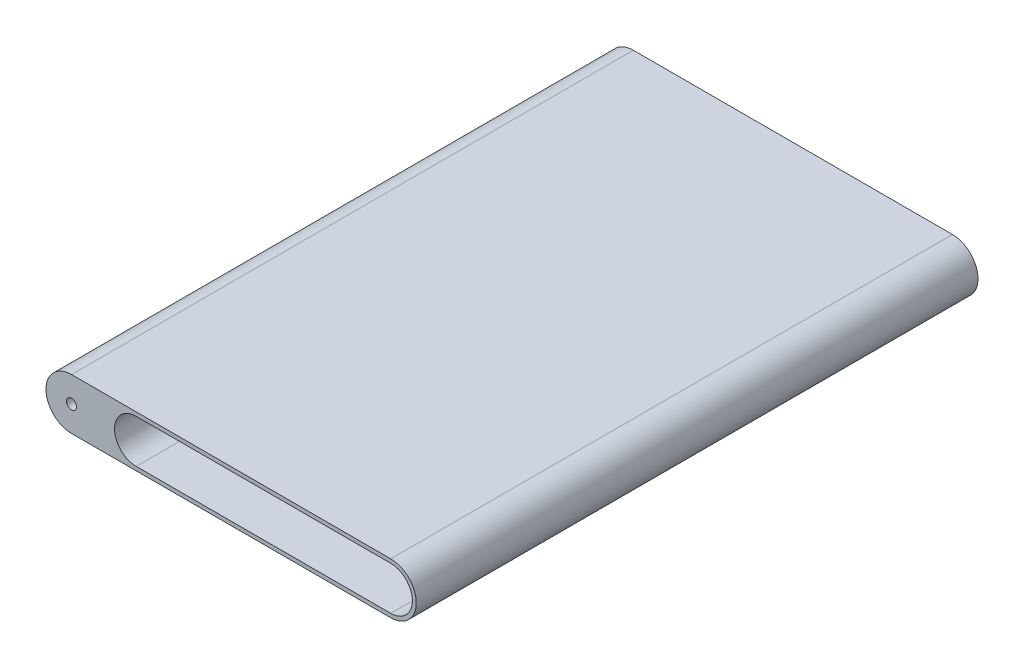
ISO-10303-21;
HEADER;
FILE_DESCRIPTION(('STEP AP214'),'2;1');
FILE_NAME('part.step','',(''),(''),'','','');
FILE_SCHEMA(('AUTOMOTIVE_DESIGN { 1 0 10303 214 1 1 1 1 }'));
ENDSEC;
DATA;
#1=APPLICATION_CONTEXT('core data for automotive mechanical design processes');
#2=APPLICATION_PROTOCOL_DEFINITION('international standard','automotive_design',2000,#1);
#3=PRODUCT_CONTEXT('',#1,'mechanical');
#4=PRODUCT('Part','Part','',(#3));
#5=PRODUCT_RELATED_PRODUCT_CATEGORY('part','',(#4));
#6=PRODUCT_DEFINITION_FORMATION('','',#4);
#7=PRODUCT_DEFINITION_CONTEXT('part definition',#1,'design');
#8=PRODUCT_DEFINITION('design','',#6,#7);
#9=PRODUCT_DEFINITION_SHAPE('','',#8);
#10=(LENGTH_UNIT() NAMED_UNIT(*) SI_UNIT(.MILLI.,.METRE.));
#11=(NAMED_UNIT(*) PLANE_ANGLE_UNIT() SI_UNIT($,.RADIAN.));
#12=(NAMED_UNIT(*) SI_UNIT($,.STERADIAN.) SOLID_ANGLE_UNIT());
#13=UNCERTAINTY_MEASURE_WITH_UNIT(LENGTH_MEASURE(1.E-05),#10,'distance_accuracy_value','');
#14=(GEOMETRIC_REPRESENTATION_CONTEXT(3) GLOBAL_UNCERTAINTY_ASSIGNED_CONTEXT((#13)) GLOBAL_UNIT_ASSIGNED_CONTEXT((#10,
#11,#12)) REPRESENTATION_CONTEXT('',''));
#15=CARTESIAN_POINT('',(0.,0.,0.));
#16=DIRECTION('',(0.,0.,1.));
#17=DIRECTION('',(1.,0.,0.));
#18=AXIS2_PLACEMENT_3D('',#15,#16,#17);
#19=CARTESIAN_POINT('',(0.,0.,1117.6));
#20=DIRECTION('',(0.,0.,-1.));
#21=DIRECTION('',(-1.,0.,0.));
#22=AXIS2_PLACEMENT_3D('',#19,#20,#21);
#23=CYLINDRICAL_SURFACE('',#22,50.8);
#24=CARTESIAN_POINT('',(0.,0.,0.));
#25=DIRECTION('',(0.,0.,1.));
#26=DIRECTION('',(1.,0.,0.));
#27=AXIS2_PLACEMENT_3D('',#24,#25,#26);
#28=CIRCLE('',#27,50.8);
#29=CARTESIAN_POINT('',(0.,-50.8,0.));
#30=VERTEX_POINT('',#29);
#31=CARTESIAN_POINT('',(0.,50.8,0.));
#32=VERTEX_POINT('',#31);
#33=EDGE_CURVE('E137',#30,#32,#28,.T.);
#34=ORIENTED_EDGE('',*,*,#33,.T.);
#35=DIRECTION('',(0.,0.,-1.));
#36=VECTOR('',#35,1.);
#37=CARTESIAN_POINT('',(0.,50.8,1117.6));
#38=LINE('',#37,#36);
#39=CARTESIAN_POINT('',(0.,50.8,1117.6));
#40=VERTEX_POINT('',#39);
#41=EDGE_CURVE('E11',#40,#32,#38,.T.);
#42=ORIENTED_EDGE('',*,*,#41,.F.);
#43=CARTESIAN_POINT('',(0.,0.,1117.6));
#44=DIRECTION('',(0.,0.,1.));
#45=DIRECTION('',(1.,0.,0.));
#46=AXIS2_PLACEMENT_3D('',#43,#44,#45);
#47=CIRCLE('',#46,50.8);
#48=CARTESIAN_POINT('',(0.,-50.8,1117.6));
#49=VERTEX_POINT('',#48);
#50=EDGE_CURVE('E146',#49,#40,#47,.T.);
#51=ORIENTED_EDGE('',*,*,#50,.F.);
#52=DIRECTION('',(0.,0.,-1.));
#53=VECTOR('',#52,1.);
#54=CARTESIAN_POINT('',(0.,-50.8,1117.6));
#55=LINE('',#54,#53);
#56=EDGE_CURVE('E156',#49,#30,#55,.T.);
#57=ORIENTED_EDGE('',*,*,#56,.T.);
#58=EDGE_LOOP('',(#34,#42,#51,#57));
#59=FACE_BOUND('',#58,.T.);
#60=ADVANCED_FACE('F39',(#59),#23,.T.);
#61=CARTESIAN_POINT('',(0.,50.8,1117.6));
#62=DIRECTION('',(0.,-1.,0.));
#63=DIRECTION('',(1.,0.,0.));
#64=AXIS2_PLACEMENT_3D('',#61,#62,#63);
#65=PLANE('',#64);
#66=DIRECTION('',(-1.,0.,0.));
#67=VECTOR('',#66,1.);
#68=CARTESIAN_POINT('',(0.,50.8,0.));
#69=LINE('',#68,#67);
#70=CARTESIAN_POINT('',(-635.,50.7999999999999,0.));
#71=VERTEX_POINT('',#70);
#72=EDGE_CURVE('E159',#32,#71,#69,.T.);
#73=ORIENTED_EDGE('',*,*,#72,.T.);
#74=DIRECTION('',(0.,0.,-1.));
#75=VECTOR('',#74,1.);
#76=CARTESIAN_POINT('',(-635.,50.7999999999999,1117.6));
#77=LINE('',#76,#75);
#78=CARTESIAN_POINT('',(-635.,50.7999999999999,1117.6));
#79=VERTEX_POINT('',#78);
#80=EDGE_CURVE('E46',#79,#71,#77,.T.);
#81=ORIENTED_EDGE('',*,*,#80,.F.);
#82=DIRECTION('',(-1.,0.,0.));
#83=VECTOR('',#82,1.);
#84=CARTESIAN_POINT('',(0.,50.8,1117.6));
#85=LINE('',#84,#83);
#86=EDGE_CURVE('E149',#40,#79,#85,.T.);
#87=ORIENTED_EDGE('',*,*,#86,.F.);
#88=ORIENTED_EDGE('',*,*,#41,.T.);
#89=EDGE_LOOP('',(#73,#81,#87,#88));
#90=FACE_BOUND('',#89,.T.);
#91=ADVANCED_FACE('F188',(#90),#65,.F.);
#92=CARTESIAN_POINT('',(-635.,0.,1117.6));
#93=DIRECTION('',(0.,0.,-1.));
#94=DIRECTION('',(-1.,0.,0.));
#95=AXIS2_PLACEMENT_3D('',#92,#93,#94);
#96=CYLINDRICAL_SURFACE('',#95,50.8);
#97=CARTESIAN_POINT('',(-635.,0.,0.));
#98=DIRECTION('',(0.,0.,1.));
#99=DIRECTION('',(1.,0.,0.));
#100=AXIS2_PLACEMENT_3D('',#97,#98,#99);
#101=CIRCLE('',#100,50.8);
#102=CARTESIAN_POINT('',(-635.,-50.8000000000001,0.));
#103=VERTEX_POINT('',#102);
#104=EDGE_CURVE('E161',#71,#103,#101,.T.);
#105=ORIENTED_EDGE('',*,*,#104,.T.);
#106=DIRECTION('',(0.,0.,-1.));
#107=VECTOR('',#106,1.);
#108=CARTESIAN_POINT('',(-635.,-50.8000000000001,1117.6));
#109=LINE('',#108,#107);
#110=CARTESIAN_POINT('',(-635.,-50.8000000000001,1117.6));
#111=VERTEX_POINT('',#110);
#112=EDGE_CURVE('E166',#111,#103,#109,.T.);
#113=ORIENTED_EDGE('',*,*,#112,.F.);
#114=CARTESIAN_POINT('',(-635.,0.,1117.6));
#115=DIRECTION('',(0.,0.,1.));
#116=DIRECTION('',(1.,0.,0.));
#117=AXIS2_PLACEMENT_3D('',#114,#115,#116);
#118=CIRCLE('',#117,50.8);
#119=EDGE_CURVE('E152',#79,#111,#118,.T.);
#120=ORIENTED_EDGE('',*,*,#119,.F.);
#121=ORIENTED_EDGE('',*,*,#80,.T.);
#122=EDGE_LOOP('',(#105,#113,#120,#121));
#123=FACE_BOUND('',#122,.T.);
#124=ADVANCED_FACE('F173',(#123),#96,.T.);
#125=CARTESIAN_POINT('',(0.,-50.8,1117.6));
#126=DIRECTION('',(0.,1.,0.));
#127=DIRECTION('',(-1.,0.,0.));
#128=AXIS2_PLACEMENT_3D('',#125,#126,#127);
#129=PLANE('',#128);
#130=DIRECTION('',(1.,0.,0.));
#131=VECTOR('',#130,1.);
#132=CARTESIAN_POINT('',(0.,-50.8,0.));
#133=LINE('',#132,#131);
#134=EDGE_CURVE('E150',#103,#30,#133,.T.);
#135=ORIENTED_EDGE('',*,*,#134,.T.);
#136=ORIENTED_EDGE('',*,*,#56,.F.);
#137=DIRECTION('',(1.,0.,0.));
#138=VECTOR('',#137,1.);
#139=CARTESIAN_POINT('',(0.,-50.8,1117.6));
#140=LINE('',#139,#138);
#141=EDGE_CURVE('E154',#111,#49,#140,.T.);
#142=ORIENTED_EDGE('',*,*,#141,.F.);
#143=ORIENTED_EDGE('',*,*,#112,.T.);
#144=EDGE_LOOP('',(#135,#136,#142,#143));
#145=FACE_BOUND('',#144,.T.);
#146=ADVANCED_FACE('F181',(#145),#129,.F.);
#147=CARTESIAN_POINT('',(0.,0.,1117.6));
#148=DIRECTION('',(0.,0.,1.));
#149=DIRECTION('',(1.,0.,0.));
#150=AXIS2_PLACEMENT_3D('',#147,#148,#149);
#151=PLANE('',#150);
#152=CARTESIAN_POINT('',(0.,0.,1117.6));
#153=DIRECTION('',(0.,0.,1.));
#154=DIRECTION('',(1.,0.,0.));
#155=AXIS2_PLACEMENT_3D('',#152,#153,#154);
#156=CIRCLE('',#155,43.1046435129124);
#157=CARTESIAN_POINT('',(0.,-43.1046435129124,1117.6));
#158=VERTEX_POINT('',#157);
#159=CARTESIAN_POINT('',(0.,43.1046435129124,1117.6));
#160=VERTEX_POINT('',#159);
#161=EDGE_CURVE('E53',#158,#160,#156,.T.);
#162=ORIENTED_EDGE('',*,*,#161,.F.);
#163=DIRECTION('',(1.,0.,0.));
#164=VECTOR('',#163,1.);
#165=CARTESIAN_POINT('',(0.,-43.1046435129124,1117.6));
#166=LINE('',#165,#164);
#167=CARTESIAN_POINT('',(-506.395864424996,-43.1046435129124,1117.6));
#168=VERTEX_POINT('',#167);
#169=EDGE_CURVE('E121',#168,#158,#166,.T.);
#170=ORIENTED_EDGE('',*,*,#169,.F.);
#171=CARTESIAN_POINT('',(-506.395864424996,0.,1117.6));
#172=DIRECTION('',(0.,0.,1.));
#173=DIRECTION('',(1.,0.,0.));
#174=AXIS2_PLACEMENT_3D('',#171,#172,#173);
#175=CIRCLE('',#174,43.1046435129124);
#176=CARTESIAN_POINT('',(-506.395864424996,43.1046435129124,1117.6));
#177=VERTEX_POINT('',#176);
#178=EDGE_CURVE('E124',#177,#168,#175,.T.);
#179=ORIENTED_EDGE('',*,*,#178,.F.);
#180=DIRECTION('',(-1.,0.,0.));
#181=VECTOR('',#180,1.);
#182=CARTESIAN_POINT('',(0.,43.1046435129124,1117.6));
#183=LINE('',#182,#181);
#184=EDGE_CURVE('E130',#160,#177,#183,.T.);
#185=ORIENTED_EDGE('',*,*,#184,.F.);
#186=EDGE_LOOP('',(#162,#170,#179,#185));
#187=FACE_BOUND('',#186,.T.);
#188=CARTESIAN_POINT('',(-635.,0.,1117.6));
#189=DIRECTION('',(0.,0.,1.));
#190=DIRECTION('',(1.,0.,0.));
#191=AXIS2_PLACEMENT_3D('',#188,#189,#190);
#192=CIRCLE('',#191,9.99999999999998);
#193=CARTESIAN_POINT('',(-625.,0.,1117.6));
#194=VERTEX_POINT('',#193);
#195=EDGE_CURVE('E143',#194,#194,#192,.T.);
#196=ORIENTED_EDGE('',*,*,#195,.F.);
#197=EDGE_LOOP('',(#196));
#198=FACE_BOUND('',#197,.T.);
#199=ORIENTED_EDGE('',*,*,#50,.T.);
#200=ORIENTED_EDGE('',*,*,#86,.T.);
#201=ORIENTED_EDGE('',*,*,#119,.T.);
#202=ORIENTED_EDGE('',*,*,#141,.T.);
#203=EDGE_LOOP('',(#199,#200,#201,#202));
#204=FACE_BOUND('',#203,.T.);
#205=ADVANCED_FACE('F187',(#187,#198,#204),#151,.T.);
#206=CARTESIAN_POINT('',(0.,0.,0.));
#207=DIRECTION('',(0.,0.,1.));
#208=DIRECTION('',(1.,0.,0.));
#209=AXIS2_PLACEMENT_3D('',#206,#207,#208);
#210=PLANE('',#209);
#211=DIRECTION('',(1.,0.,0.));
#212=VECTOR('',#211,1.);
#213=CARTESIAN_POINT('',(0.,-43.1046435129124,0.));
#214=LINE('',#213,#212);
#215=CARTESIAN_POINT('',(-506.395864424996,-43.1046435129124,0.));
#216=VERTEX_POINT('',#215);
#217=CARTESIAN_POINT('',(0.,-43.1046435129124,0.));
#218=VERTEX_POINT('',#217);
#219=EDGE_CURVE('E111',#216,#218,#214,.T.);
#220=ORIENTED_EDGE('',*,*,#219,.T.);
#221=CARTESIAN_POINT('',(0.,0.,0.));
#222=DIRECTION('',(0.,0.,1.));
#223=DIRECTION('',(1.,0.,0.));
#224=AXIS2_PLACEMENT_3D('',#221,#222,#223);
#225=CIRCLE('',#224,43.1046435129124);
#226=CARTESIAN_POINT('',(0.,43.1046435129124,0.));
#227=VERTEX_POINT('',#226);
#228=EDGE_CURVE('E105',#218,#227,#225,.T.);
#229=ORIENTED_EDGE('',*,*,#228,.T.);
#230=DIRECTION('',(-1.,0.,0.));
#231=VECTOR('',#230,1.);
#232=CARTESIAN_POINT('',(0.,43.1046435129124,0.));
#233=LINE('',#232,#231);
#234=CARTESIAN_POINT('',(-506.395864424996,43.1046435129124,0.));
#235=VERTEX_POINT('',#234);
#236=EDGE_CURVE('E114',#227,#235,#233,.T.);
#237=ORIENTED_EDGE('',*,*,#236,.T.);
#238=CARTESIAN_POINT('',(-506.395864424996,0.,0.));
#239=DIRECTION('',(0.,0.,1.));
#240=DIRECTION('',(1.,0.,0.));
#241=AXIS2_PLACEMENT_3D('',#238,#239,#240);
#242=CIRCLE('',#241,43.1046435129124);
#243=EDGE_CURVE('E61',#235,#216,#242,.T.);
#244=ORIENTED_EDGE('',*,*,#243,.T.);
#245=EDGE_LOOP('',(#220,#229,#237,#244));
#246=FACE_BOUND('',#245,.T.);
#247=CARTESIAN_POINT('',(-635.,0.,0.));
#248=DIRECTION('',(0.,0.,1.));
#249=DIRECTION('',(1.,0.,0.));
#250=AXIS2_PLACEMENT_3D('',#247,#248,#249);
#251=CIRCLE('',#250,9.99999999999998);
#252=CARTESIAN_POINT('',(-625.,0.,0.));
#253=VERTEX_POINT('',#252);
#254=EDGE_CURVE('E131',#253,#253,#251,.T.);
#255=ORIENTED_EDGE('',*,*,#254,.T.);
#256=EDGE_LOOP('',(#255));
#257=FACE_BOUND('',#256,.T.);
#258=ORIENTED_EDGE('',*,*,#33,.F.);
#259=ORIENTED_EDGE('',*,*,#134,.F.);
#260=ORIENTED_EDGE('',*,*,#104,.F.);
#261=ORIENTED_EDGE('',*,*,#72,.F.);
#262=EDGE_LOOP('',(#258,#259,#260,#261));
#263=FACE_BOUND('',#262,.T.);
#264=ADVANCED_FACE('F118',(#246,#257,#263),#210,.F.);
#265=CARTESIAN_POINT('',(-635.,0.,0.));
#266=DIRECTION('',(0.,0.,1.));
#267=DIRECTION('',(1.,0.,0.));
#268=AXIS2_PLACEMENT_3D('',#265,#266,#267);
#269=CYLINDRICAL_SURFACE('',#268,9.99999999999998);
#270=ORIENTED_EDGE('',*,*,#254,.F.);
#271=EDGE_LOOP('',(#270));
#272=FACE_BOUND('',#271,.T.);
#273=ORIENTED_EDGE('',*,*,#195,.T.);
#274=EDGE_LOOP('',(#273));
#275=FACE_BOUND('',#274,.T.);
#276=ADVANCED_FACE('F200',(#272,#275),#269,.F.);
#277=CARTESIAN_POINT('',(0.,0.,0.));
#278=DIRECTION('',(0.,0.,1.));
#279=DIRECTION('',(1.,0.,0.));
#280=AXIS2_PLACEMENT_3D('',#277,#278,#279);
#281=CYLINDRICAL_SURFACE('',#280,43.1046435129124);
#282=ORIENTED_EDGE('',*,*,#161,.T.);
#283=DIRECTION('',(0.,0.,1.));
#284=VECTOR('',#283,1.);
#285=CARTESIAN_POINT('',(0.,43.1046435129124,0.));
#286=LINE('',#285,#284);
#287=EDGE_CURVE('E101',#227,#160,#286,.T.);
#288=ORIENTED_EDGE('',*,*,#287,.F.);
#289=ORIENTED_EDGE('',*,*,#228,.F.);
#290=DIRECTION('',(0.,0.,1.));
#291=VECTOR('',#290,1.);
#292=CARTESIAN_POINT('',(0.,-43.1046435129124,0.));
#293=LINE('',#292,#291);
#294=EDGE_CURVE('E135',#218,#158,#293,.T.);
#295=ORIENTED_EDGE('',*,*,#294,.T.);
#296=EDGE_LOOP('',(#282,#288,#289,#295));
#297=FACE_BOUND('',#296,.T.);
#298=ADVANCED_FACE('F103',(#297),#281,.F.);
#299=CARTESIAN_POINT('',(0.,-43.1046435129124,0.));
#300=DIRECTION('',(0.,-1.,0.));
#301=DIRECTION('',(0.,0.,-1.));
#302=AXIS2_PLACEMENT_3D('',#299,#300,#301);
#303=PLANE('',#302);
#304=ORIENTED_EDGE('',*,*,#169,.T.);
#305=ORIENTED_EDGE('',*,*,#294,.F.);
#306=ORIENTED_EDGE('',*,*,#219,.F.);
#307=DIRECTION('',(0.,0.,1.));
#308=VECTOR('',#307,1.);
#309=CARTESIAN_POINT('',(-506.395864424996,-43.1046435129124,0.));
#310=LINE('',#309,#308);
#311=EDGE_CURVE('E138',#216,#168,#310,.T.);
#312=ORIENTED_EDGE('',*,*,#311,.T.);
#313=EDGE_LOOP('',(#304,#305,#306,#312));
#314=FACE_BOUND('',#313,.T.);
#315=ADVANCED_FACE('F209',(#314),#303,.F.);
#316=CARTESIAN_POINT('',(-506.395864424996,0.,0.));
#317=DIRECTION('',(0.,0.,1.));
#318=DIRECTION('',(1.,0.,0.));
#319=AXIS2_PLACEMENT_3D('',#316,#317,#318);
#320=CYLINDRICAL_SURFACE('',#319,43.1046435129124);
#321=ORIENTED_EDGE('',*,*,#178,.T.);
#322=ORIENTED_EDGE('',*,*,#311,.F.);
#323=ORIENTED_EDGE('',*,*,#243,.F.);
#324=DIRECTION('',(0.,0.,1.));
#325=VECTOR('',#324,1.);
#326=CARTESIAN_POINT('',(-506.395864424996,43.1046435129124,0.));
#327=LINE('',#326,#325);
#328=EDGE_CURVE('E110',#235,#177,#327,.T.);
#329=ORIENTED_EDGE('',*,*,#328,.T.);
#330=EDGE_LOOP('',(#321,#322,#323,#329));
#331=FACE_BOUND('',#330,.T.);
#332=ADVANCED_FACE('F212',(#331),#320,.F.);
#333=CARTESIAN_POINT('',(0.,43.1046435129124,0.));
#334=DIRECTION('',(0.,1.,0.));
#335=DIRECTION('',(0.,0.,1.));
#336=AXIS2_PLACEMENT_3D('',#333,#334,#335);
#337=PLANE('',#336);
#338=ORIENTED_EDGE('',*,*,#184,.T.);
#339=ORIENTED_EDGE('',*,*,#328,.F.);
#340=ORIENTED_EDGE('',*,*,#236,.F.);
#341=ORIENTED_EDGE('',*,*,#287,.T.);
#342=EDGE_LOOP('',(#338,#339,#340,#341));
#343=FACE_BOUND('',#342,.T.);
#344=ADVANCED_FACE('F115',(#343),#337,.F.);
#345=CLOSED_SHELL('',(#60,#91,#124,#146,#205,#264,#276,#298,#315,#332,#344));
#346=MANIFOLD_SOLID_BREP('B2',#345);
#347=ADVANCED_BREP_SHAPE_REPRESENTATION('',(#18,#346),#14);
#348=SHAPE_DEFINITION_REPRESENTATION(#9,#347);
ENDSEC;
END-ISO-10303-21;
